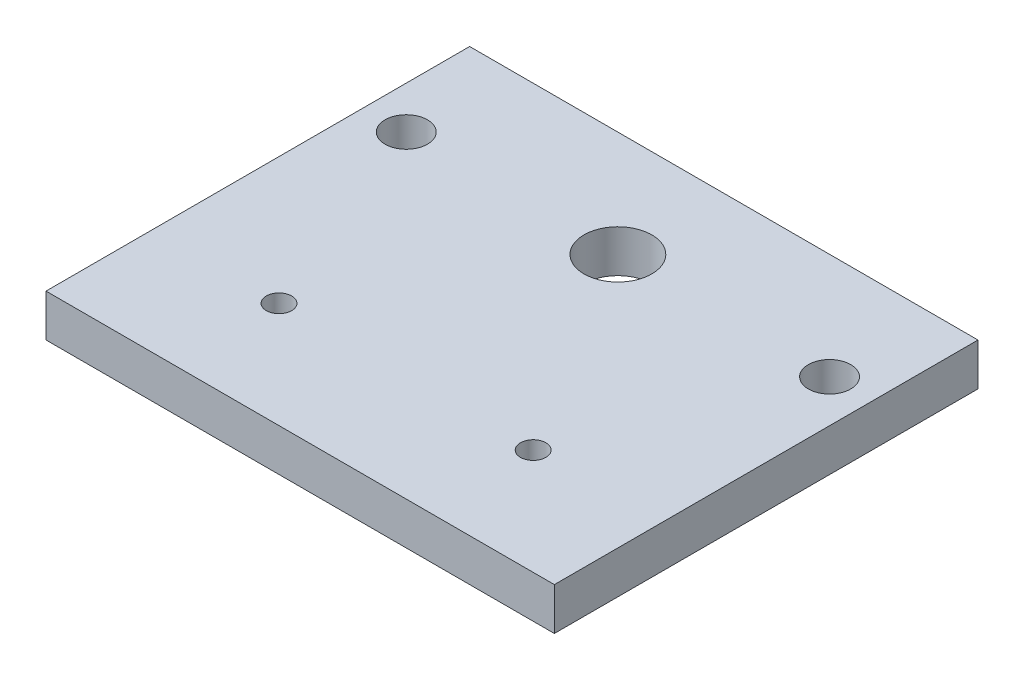
ISO-10303-21;
HEADER;
FILE_DESCRIPTION(('STEP AP214'),'2;1');
FILE_NAME('part.step','',(''),(''),'','','');
FILE_SCHEMA(('AUTOMOTIVE_DESIGN { 1 0 10303 214 1 1 1 1 }'));
ENDSEC;
DATA;
#1=APPLICATION_CONTEXT('core data for automotive mechanical design processes');
#2=APPLICATION_PROTOCOL_DEFINITION('international standard','automotive_design',2000,#1);
#3=PRODUCT_CONTEXT('',#1,'mechanical');
#4=PRODUCT('Part','Part','',(#3));
#5=PRODUCT_RELATED_PRODUCT_CATEGORY('part','',(#4));
#6=PRODUCT_DEFINITION_FORMATION('','',#4);
#7=PRODUCT_DEFINITION_CONTEXT('part definition',#1,'design');
#8=PRODUCT_DEFINITION('design','',#6,#7);
#9=PRODUCT_DEFINITION_SHAPE('','',#8);
#10=(LENGTH_UNIT() NAMED_UNIT(*) SI_UNIT(.MILLI.,.METRE.));
#11=(NAMED_UNIT(*) PLANE_ANGLE_UNIT() SI_UNIT($,.RADIAN.));
#12=(NAMED_UNIT(*) SI_UNIT($,.STERADIAN.) SOLID_ANGLE_UNIT());
#13=UNCERTAINTY_MEASURE_WITH_UNIT(LENGTH_MEASURE(1.E-05),#10,'distance_accuracy_value','');
#14=(GEOMETRIC_REPRESENTATION_CONTEXT(3) GLOBAL_UNCERTAINTY_ASSIGNED_CONTEXT((#13)) GLOBAL_UNIT_ASSIGNED_CONTEXT((#10,
#11,#12)) REPRESENTATION_CONTEXT('',''));
#15=CARTESIAN_POINT('',(0.,0.,0.));
#16=DIRECTION('',(0.,0.,1.));
#17=DIRECTION('',(1.,0.,0.));
#18=AXIS2_PLACEMENT_3D('',#15,#16,#17);
#19=CARTESIAN_POINT('',(0.,5.,0.));
#20=DIRECTION('',(0.,1.,0.));
#21=DIRECTION('',(0.,0.,1.));
#22=AXIS2_PLACEMENT_3D('',#19,#20,#21);
#23=PLANE('',#22);
#24=CARTESIAN_POINT('',(5.00000825262357,5.,12.4796866765221));
#25=DIRECTION('',(0.,1.,0.));
#26=DIRECTION('',(0.,0.,1.));
#27=AXIS2_PLACEMENT_3D('',#24,#25,#26);
#28=CIRCLE('',#27,2.5);
#29=CARTESIAN_POINT('',(5.00000825262357,5.,14.9796866765221));
#30=VERTEX_POINT('',#29);
#31=EDGE_CURVE('E127',#30,#30,#28,.T.);
#32=ORIENTED_EDGE('',*,*,#31,.F.);
#33=EDGE_LOOP('',(#32));
#34=FACE_BOUND('',#33,.T.);
#35=CARTESIAN_POINT('',(15.,5.,37.5));
#36=DIRECTION('',(0.,1.,0.));
#37=DIRECTION('',(0.,0.,1.));
#38=AXIS2_PLACEMENT_3D('',#35,#36,#37);
#39=CIRCLE('',#38,1.5);
#40=CARTESIAN_POINT('',(15.,5.,39.));
#41=VERTEX_POINT('',#40);
#42=EDGE_CURVE('E115',#41,#41,#39,.T.);
#43=ORIENTED_EDGE('',*,*,#42,.F.);
#44=EDGE_LOOP('',(#43));
#45=FACE_BOUND('',#44,.T.);
#46=DIRECTION('',(0.,0.,1.));
#47=VECTOR('',#46,1.);
#48=CARTESIAN_POINT('',(0.,5.,0.));
#49=LINE('',#48,#47);
#50=CARTESIAN_POINT('',(0.,5.,0.));
#51=VERTEX_POINT('',#50);
#52=CARTESIAN_POINT('',(0.,5.,50.));
#53=VERTEX_POINT('',#52);
#54=EDGE_CURVE('E85',#51,#53,#49,.T.);
#55=ORIENTED_EDGE('',*,*,#54,.T.);
#56=DIRECTION('',(1.,0.,0.));
#57=VECTOR('',#56,1.);
#58=CARTESIAN_POINT('',(0.,5.,50.));
#59=LINE('',#58,#57);
#60=CARTESIAN_POINT('',(60.,5.,50.));
#61=VERTEX_POINT('',#60);
#62=EDGE_CURVE('E80',#53,#61,#59,.T.);
#63=ORIENTED_EDGE('',*,*,#62,.T.);
#64=DIRECTION('',(0.,0.,-1.));
#65=VECTOR('',#64,1.);
#66=CARTESIAN_POINT('',(60.,5.,0.));
#67=LINE('',#66,#65);
#68=CARTESIAN_POINT('',(60.,5.,0.));
#69=VERTEX_POINT('',#68);
#70=EDGE_CURVE('E83',#61,#69,#67,.T.);
#71=ORIENTED_EDGE('',*,*,#70,.T.);
#72=DIRECTION('',(-1.,0.,0.));
#73=VECTOR('',#72,1.);
#74=CARTESIAN_POINT('',(0.,5.,0.));
#75=LINE('',#74,#73);
#76=EDGE_CURVE('E50',#69,#51,#75,.T.);
#77=ORIENTED_EDGE('',*,*,#76,.T.);
#78=EDGE_LOOP('',(#55,#63,#71,#77));
#79=FACE_BOUND('',#78,.T.);
#80=CARTESIAN_POINT('',(30.,5.,12.5));
#81=DIRECTION('',(0.,1.,0.));
#82=DIRECTION('',(0.,0.,1.));
#83=AXIS2_PLACEMENT_3D('',#80,#81,#82);
#84=CIRCLE('',#83,4.00000000000001);
#85=CARTESIAN_POINT('',(30.,5.,16.5));
#86=VERTEX_POINT('',#85);
#87=EDGE_CURVE('E100',#86,#86,#84,.T.);
#88=ORIENTED_EDGE('',*,*,#87,.F.);
#89=EDGE_LOOP('',(#88));
#90=FACE_BOUND('',#89,.T.);
#91=CARTESIAN_POINT('',(45.,5.,37.5));
#92=DIRECTION('',(0.,1.,0.));
#93=DIRECTION('',(0.,0.,1.));
#94=AXIS2_PLACEMENT_3D('',#91,#92,#93);
#95=CIRCLE('',#94,1.5);
#96=CARTESIAN_POINT('',(45.,5.,39.));
#97=VERTEX_POINT('',#96);
#98=EDGE_CURVE('E121',#97,#97,#95,.T.);
#99=ORIENTED_EDGE('',*,*,#98,.F.);
#100=EDGE_LOOP('',(#99));
#101=FACE_BOUND('',#100,.T.);
#102=CARTESIAN_POINT('',(54.9999917473764,5.,12.5203133234779));
#103=DIRECTION('',(0.,1.,0.));
#104=DIRECTION('',(0.,0.,1.));
#105=AXIS2_PLACEMENT_3D('',#102,#103,#104);
#106=CIRCLE('',#105,2.5);
#107=CARTESIAN_POINT('',(54.9999917473764,5.,15.0203133234779));
#108=VERTEX_POINT('',#107);
#109=EDGE_CURVE('E133',#108,#108,#106,.T.);
#110=ORIENTED_EDGE('',*,*,#109,.F.);
#111=EDGE_LOOP('',(#110));
#112=FACE_BOUND('',#111,.T.);
#113=ADVANCED_FACE('F33',(#34,#45,#79,#90,#101,#112),#23,.T.);
#114=CARTESIAN_POINT('',(0.,0.,0.));
#115=DIRECTION('',(0.,1.,0.));
#116=DIRECTION('',(0.,0.,1.));
#117=AXIS2_PLACEMENT_3D('',#114,#115,#116);
#118=PLANE('',#117);
#119=DIRECTION('',(0.,0.,1.));
#120=VECTOR('',#119,1.);
#121=CARTESIAN_POINT('',(0.,0.,0.));
#122=LINE('',#121,#120);
#123=CARTESIAN_POINT('',(0.,0.,0.));
#124=VERTEX_POINT('',#123);
#125=CARTESIAN_POINT('',(0.,0.,50.));
#126=VERTEX_POINT('',#125);
#127=EDGE_CURVE('E97',#124,#126,#122,.T.);
#128=ORIENTED_EDGE('',*,*,#127,.F.);
#129=DIRECTION('',(-1.,0.,0.));
#130=VECTOR('',#129,1.);
#131=CARTESIAN_POINT('',(0.,0.,0.));
#132=LINE('',#131,#130);
#133=CARTESIAN_POINT('',(60.,0.,0.));
#134=VERTEX_POINT('',#133);
#135=EDGE_CURVE('E73',#134,#124,#132,.T.);
#136=ORIENTED_EDGE('',*,*,#135,.F.);
#137=DIRECTION('',(0.,0.,-1.));
#138=VECTOR('',#137,1.);
#139=CARTESIAN_POINT('',(60.,0.,0.));
#140=LINE('',#139,#138);
#141=CARTESIAN_POINT('',(60.,0.,50.));
#142=VERTEX_POINT('',#141);
#143=EDGE_CURVE('E67',#142,#134,#140,.T.);
#144=ORIENTED_EDGE('',*,*,#143,.F.);
#145=DIRECTION('',(1.,0.,0.));
#146=VECTOR('',#145,1.);
#147=CARTESIAN_POINT('',(0.,0.,50.));
#148=LINE('',#147,#146);
#149=EDGE_CURVE('E89',#126,#142,#148,.T.);
#150=ORIENTED_EDGE('',*,*,#149,.F.);
#151=EDGE_LOOP('',(#128,#136,#144,#150));
#152=FACE_BOUND('',#151,.T.);
#153=CARTESIAN_POINT('',(30.,0.,12.5));
#154=DIRECTION('',(0.,1.,0.));
#155=DIRECTION('',(0.,0.,1.));
#156=AXIS2_PLACEMENT_3D('',#153,#154,#155);
#157=CIRCLE('',#156,4.00000000000001);
#158=CARTESIAN_POINT('',(30.,0.,16.5));
#159=VERTEX_POINT('',#158);
#160=EDGE_CURVE('E112',#159,#159,#157,.T.);
#161=ORIENTED_EDGE('',*,*,#160,.T.);
#162=EDGE_LOOP('',(#161));
#163=FACE_BOUND('',#162,.T.);
#164=CARTESIAN_POINT('',(15.,0.,37.5));
#165=DIRECTION('',(0.,1.,0.));
#166=DIRECTION('',(0.,0.,1.));
#167=AXIS2_PLACEMENT_3D('',#164,#165,#166);
#168=CIRCLE('',#167,1.5);
#169=CARTESIAN_POINT('',(15.,0.,39.));
#170=VERTEX_POINT('',#169);
#171=EDGE_CURVE('E118',#170,#170,#168,.T.);
#172=ORIENTED_EDGE('',*,*,#171,.T.);
#173=EDGE_LOOP('',(#172));
#174=FACE_BOUND('',#173,.T.);
#175=CARTESIAN_POINT('',(45.,0.,37.5));
#176=DIRECTION('',(0.,1.,0.));
#177=DIRECTION('',(0.,0.,1.));
#178=AXIS2_PLACEMENT_3D('',#175,#176,#177);
#179=CIRCLE('',#178,1.5);
#180=CARTESIAN_POINT('',(45.,0.,39.));
#181=VERTEX_POINT('',#180);
#182=EDGE_CURVE('E124',#181,#181,#179,.T.);
#183=ORIENTED_EDGE('',*,*,#182,.T.);
#184=EDGE_LOOP('',(#183));
#185=FACE_BOUND('',#184,.T.);
#186=CARTESIAN_POINT('',(5.00000825262357,0.,12.4796866765221));
#187=DIRECTION('',(0.,1.,0.));
#188=DIRECTION('',(0.,0.,1.));
#189=AXIS2_PLACEMENT_3D('',#186,#187,#188);
#190=CIRCLE('',#189,2.5);
#191=CARTESIAN_POINT('',(5.00000825262357,0.,14.9796866765221));
#192=VERTEX_POINT('',#191);
#193=EDGE_CURVE('E130',#192,#192,#190,.T.);
#194=ORIENTED_EDGE('',*,*,#193,.T.);
#195=EDGE_LOOP('',(#194));
#196=FACE_BOUND('',#195,.T.);
#197=CARTESIAN_POINT('',(54.9999917473764,0.,12.5203133234779));
#198=DIRECTION('',(0.,1.,0.));
#199=DIRECTION('',(0.,0.,1.));
#200=AXIS2_PLACEMENT_3D('',#197,#198,#199);
#201=CIRCLE('',#200,2.5);
#202=CARTESIAN_POINT('',(54.9999917473764,0.,15.0203133234779));
#203=VERTEX_POINT('',#202);
#204=EDGE_CURVE('E136',#203,#203,#201,.T.);
#205=ORIENTED_EDGE('',*,*,#204,.T.);
#206=EDGE_LOOP('',(#205));
#207=FACE_BOUND('',#206,.T.);
#208=ADVANCED_FACE('F108',(#152,#163,#174,#185,#196,#207),#118,.F.);
#209=CARTESIAN_POINT('',(0.,5.,0.));
#210=DIRECTION('',(1.,0.,0.));
#211=DIRECTION('',(0.,0.,-1.));
#212=AXIS2_PLACEMENT_3D('',#209,#210,#211);
#213=PLANE('',#212);
#214=ORIENTED_EDGE('',*,*,#127,.T.);
#215=DIRECTION('',(0.,-1.,0.));
#216=VECTOR('',#215,1.);
#217=CARTESIAN_POINT('',(0.,5.,50.));
#218=LINE('',#217,#216);
#219=EDGE_CURVE('E11',#53,#126,#218,.T.);
#220=ORIENTED_EDGE('',*,*,#219,.F.);
#221=ORIENTED_EDGE('',*,*,#54,.F.);
#222=DIRECTION('',(0.,-1.,0.));
#223=VECTOR('',#222,1.);
#224=CARTESIAN_POINT('',(0.,5.,0.));
#225=LINE('',#224,#223);
#226=EDGE_CURVE('E93',#51,#124,#225,.T.);
#227=ORIENTED_EDGE('',*,*,#226,.T.);
#228=EDGE_LOOP('',(#214,#220,#221,#227));
#229=FACE_BOUND('',#228,.T.);
#230=ADVANCED_FACE('F35',(#229),#213,.F.);
#231=CARTESIAN_POINT('',(0.,5.,50.));
#232=DIRECTION('',(0.,0.,-1.));
#233=DIRECTION('',(-1.,0.,0.));
#234=AXIS2_PLACEMENT_3D('',#231,#232,#233);
#235=PLANE('',#234);
#236=ORIENTED_EDGE('',*,*,#149,.T.);
#237=DIRECTION('',(0.,-1.,0.));
#238=VECTOR('',#237,1.);
#239=CARTESIAN_POINT('',(60.,5.,50.));
#240=LINE('',#239,#238);
#241=EDGE_CURVE('E42',#61,#142,#240,.T.);
#242=ORIENTED_EDGE('',*,*,#241,.F.);
#243=ORIENTED_EDGE('',*,*,#62,.F.);
#244=ORIENTED_EDGE('',*,*,#219,.T.);
#245=EDGE_LOOP('',(#236,#242,#243,#244));
#246=FACE_BOUND('',#245,.T.);
#247=ADVANCED_FACE('F88',(#246),#235,.F.);
#248=CARTESIAN_POINT('',(60.,5.,0.));
#249=DIRECTION('',(-1.,0.,0.));
#250=DIRECTION('',(0.,0.,1.));
#251=AXIS2_PLACEMENT_3D('',#248,#249,#250);
#252=PLANE('',#251);
#253=ORIENTED_EDGE('',*,*,#143,.T.);
#254=DIRECTION('',(0.,-1.,0.));
#255=VECTOR('',#254,1.);
#256=CARTESIAN_POINT('',(60.,5.,0.));
#257=LINE('',#256,#255);
#258=EDGE_CURVE('E90',#69,#134,#257,.T.);
#259=ORIENTED_EDGE('',*,*,#258,.F.);
#260=ORIENTED_EDGE('',*,*,#70,.F.);
#261=ORIENTED_EDGE('',*,*,#241,.T.);
#262=EDGE_LOOP('',(#253,#259,#260,#261));
#263=FACE_BOUND('',#262,.T.);
#264=ADVANCED_FACE('F91',(#263),#252,.F.);
#265=CARTESIAN_POINT('',(0.,5.,0.));
#266=DIRECTION('',(0.,0.,1.));
#267=DIRECTION('',(1.,0.,0.));
#268=AXIS2_PLACEMENT_3D('',#265,#266,#267);
#269=PLANE('',#268);
#270=ORIENTED_EDGE('',*,*,#135,.T.);
#271=ORIENTED_EDGE('',*,*,#226,.F.);
#272=ORIENTED_EDGE('',*,*,#76,.F.);
#273=ORIENTED_EDGE('',*,*,#258,.T.);
#274=EDGE_LOOP('',(#270,#271,#272,#273));
#275=FACE_BOUND('',#274,.T.);
#276=ADVANCED_FACE('F105',(#275),#269,.F.);
#277=CARTESIAN_POINT('',(30.,5.,12.5));
#278=DIRECTION('',(0.,-1.,0.));
#279=DIRECTION('',(0.,0.,-1.));
#280=AXIS2_PLACEMENT_3D('',#277,#278,#279);
#281=CYLINDRICAL_SURFACE('',#280,4.00000000000001);
#282=ORIENTED_EDGE('',*,*,#87,.T.);
#283=EDGE_LOOP('',(#282));
#284=FACE_BOUND('',#283,.T.);
#285=ORIENTED_EDGE('',*,*,#160,.F.);
#286=EDGE_LOOP('',(#285));
#287=FACE_BOUND('',#286,.T.);
#288=ADVANCED_FACE('F155',(#284,#287),#281,.F.);
#289=CARTESIAN_POINT('',(15.,5.,37.5));
#290=DIRECTION('',(0.,-1.,0.));
#291=DIRECTION('',(0.,0.,-1.));
#292=AXIS2_PLACEMENT_3D('',#289,#290,#291);
#293=CYLINDRICAL_SURFACE('',#292,1.5);
#294=ORIENTED_EDGE('',*,*,#42,.T.);
#295=EDGE_LOOP('',(#294));
#296=FACE_BOUND('',#295,.T.);
#297=ORIENTED_EDGE('',*,*,#171,.F.);
#298=EDGE_LOOP('',(#297));
#299=FACE_BOUND('',#298,.T.);
#300=ADVANCED_FACE('F201',(#296,#299),#293,.F.);
#301=CARTESIAN_POINT('',(45.,5.,37.5));
#302=DIRECTION('',(0.,-1.,0.));
#303=DIRECTION('',(0.,0.,-1.));
#304=AXIS2_PLACEMENT_3D('',#301,#302,#303);
#305=CYLINDRICAL_SURFACE('',#304,1.5);
#306=ORIENTED_EDGE('',*,*,#98,.T.);
#307=EDGE_LOOP('',(#306));
#308=FACE_BOUND('',#307,.T.);
#309=ORIENTED_EDGE('',*,*,#182,.F.);
#310=EDGE_LOOP('',(#309));
#311=FACE_BOUND('',#310,.T.);
#312=ADVANCED_FACE('F209',(#308,#311),#305,.F.);
#313=CARTESIAN_POINT('',(5.00000825262357,5.,12.4796866765221));
#314=DIRECTION('',(0.,-1.,0.));
#315=DIRECTION('',(0.,0.,-1.));
#316=AXIS2_PLACEMENT_3D('',#313,#314,#315);
#317=CYLINDRICAL_SURFACE('',#316,2.5);
#318=ORIENTED_EDGE('',*,*,#31,.T.);
#319=EDGE_LOOP('',(#318));
#320=FACE_BOUND('',#319,.T.);
#321=ORIENTED_EDGE('',*,*,#193,.F.);
#322=EDGE_LOOP('',(#321));
#323=FACE_BOUND('',#322,.T.);
#324=ADVANCED_FACE('F217',(#320,#323),#317,.F.);
#325=CARTESIAN_POINT('',(54.9999917473764,5.,12.5203133234779));
#326=DIRECTION('',(0.,-1.,0.));
#327=DIRECTION('',(0.,0.,-1.));
#328=AXIS2_PLACEMENT_3D('',#325,#326,#327);
#329=CYLINDRICAL_SURFACE('',#328,2.5);
#330=ORIENTED_EDGE('',*,*,#109,.T.);
#331=EDGE_LOOP('',(#330));
#332=FACE_BOUND('',#331,.T.);
#333=ORIENTED_EDGE('',*,*,#204,.F.);
#334=EDGE_LOOP('',(#333));
#335=FACE_BOUND('',#334,.T.);
#336=ADVANCED_FACE('F142',(#332,#335),#329,.F.);
#337=CLOSED_SHELL('',(#113,#208,#230,#247,#264,#276,#288,#300,#312,#324,#336));
#338=MANIFOLD_SOLID_BREP('B2',#337);
#339=ADVANCED_BREP_SHAPE_REPRESENTATION('',(#18,#338),#14);
#340=SHAPE_DEFINITION_REPRESENTATION(#9,#339);
ENDSEC;
END-ISO-10303-21;
